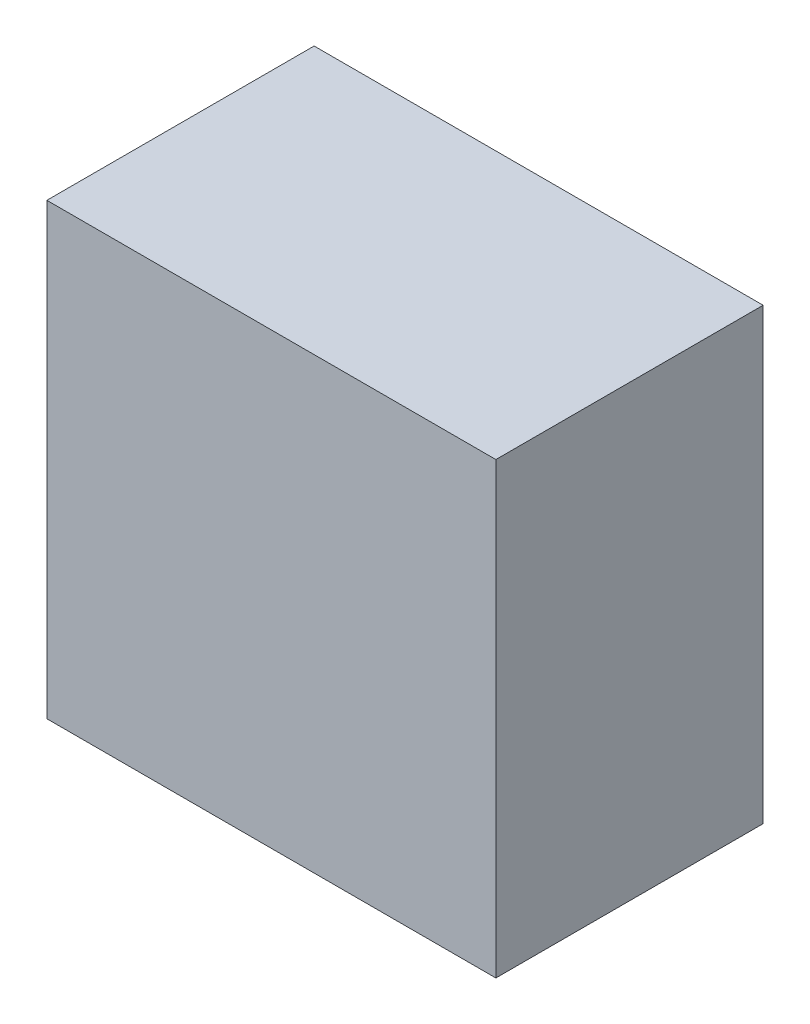
ISO-10303-21;
HEADER;
FILE_DESCRIPTION(('STEP AP214'),'2;1');
FILE_NAME('part.step','',(''),(''),'','','');
FILE_SCHEMA(('AUTOMOTIVE_DESIGN { 1 0 10303 214 1 1 1 1 }'));
ENDSEC;
DATA;
#1=APPLICATION_CONTEXT('core data for automotive mechanical design processes');
#2=APPLICATION_PROTOCOL_DEFINITION('international standard','automotive_design',2000,#1);
#3=PRODUCT_CONTEXT('',#1,'mechanical');
#4=PRODUCT('Part','Part','',(#3));
#5=PRODUCT_RELATED_PRODUCT_CATEGORY('part','',(#4));
#6=PRODUCT_DEFINITION_FORMATION('','',#4);
#7=PRODUCT_DEFINITION_CONTEXT('part definition',#1,'design');
#8=PRODUCT_DEFINITION('design','',#6,#7);
#9=PRODUCT_DEFINITION_SHAPE('','',#8);
#10=(LENGTH_UNIT() NAMED_UNIT(*) SI_UNIT(.MILLI.,.METRE.));
#11=(NAMED_UNIT(*) PLANE_ANGLE_UNIT() SI_UNIT($,.RADIAN.));
#12=(NAMED_UNIT(*) SI_UNIT($,.STERADIAN.) SOLID_ANGLE_UNIT());
#13=UNCERTAINTY_MEASURE_WITH_UNIT(LENGTH_MEASURE(1.E-05),#10,'distance_accuracy_value','');
#14=(GEOMETRIC_REPRESENTATION_CONTEXT(3) GLOBAL_UNCERTAINTY_ASSIGNED_CONTEXT((#13)) GLOBAL_UNIT_ASSIGNED_CONTEXT((#10,
#11,#12)) REPRESENTATION_CONTEXT('',''));
#15=CARTESIAN_POINT('',(0.,0.,0.));
#16=DIRECTION('',(0.,0.,1.));
#17=DIRECTION('',(1.,0.,0.));
#18=AXIS2_PLACEMENT_3D('',#15,#16,#17);
#19=CARTESIAN_POINT('',(21.,-21.,25.));
#20=DIRECTION('',(-1.,0.,0.));
#21=DIRECTION('',(0.,0.,1.));
#22=AXIS2_PLACEMENT_3D('',#19,#20,#21);
#23=PLANE('',#22);
#24=DIRECTION('',(0.,1.,0.));
#25=VECTOR('',#24,1.);
#26=CARTESIAN_POINT('',(21.,-21.,0.));
#27=LINE('',#26,#25);
#28=CARTESIAN_POINT('',(21.,-21.,0.));
#29=VERTEX_POINT('',#28);
#30=CARTESIAN_POINT('',(21.,21.,0.));
#31=VERTEX_POINT('',#30);
#32=EDGE_CURVE('E96',#29,#31,#27,.T.);
#33=ORIENTED_EDGE('',*,*,#32,.T.);
#34=DIRECTION('',(0.,0.,-1.));
#35=VECTOR('',#34,1.);
#36=CARTESIAN_POINT('',(21.,21.,25.));
#37=LINE('',#36,#35);
#38=CARTESIAN_POINT('',(21.,21.,25.));
#39=VERTEX_POINT('',#38);
#40=EDGE_CURVE('E11',#39,#31,#37,.T.);
#41=ORIENTED_EDGE('',*,*,#40,.F.);
#42=DIRECTION('',(0.,1.,0.));
#43=VECTOR('',#42,1.);
#44=CARTESIAN_POINT('',(21.,-21.,25.));
#45=LINE('',#44,#43);
#46=CARTESIAN_POINT('',(21.,-21.,25.));
#47=VERTEX_POINT('',#46);
#48=EDGE_CURVE('E84',#47,#39,#45,.T.);
#49=ORIENTED_EDGE('',*,*,#48,.F.);
#50=DIRECTION('',(0.,0.,-1.));
#51=VECTOR('',#50,1.);
#52=CARTESIAN_POINT('',(21.,-21.,25.));
#53=LINE('',#52,#51);
#54=EDGE_CURVE('E92',#47,#29,#53,.T.);
#55=ORIENTED_EDGE('',*,*,#54,.T.);
#56=EDGE_LOOP('',(#33,#41,#49,#55));
#57=FACE_BOUND('',#56,.T.);
#58=ADVANCED_FACE('F33',(#57),#23,.F.);
#59=CARTESIAN_POINT('',(-21.,21.,25.));
#60=DIRECTION('',(0.,-1.,0.));
#61=DIRECTION('',(0.,0.,-1.));
#62=AXIS2_PLACEMENT_3D('',#59,#60,#61);
#63=PLANE('',#62);
#64=DIRECTION('',(-1.,0.,0.));
#65=VECTOR('',#64,1.);
#66=CARTESIAN_POINT('',(-21.,21.,0.));
#67=LINE('',#66,#65);
#68=CARTESIAN_POINT('',(-21.,21.,0.));
#69=VERTEX_POINT('',#68);
#70=EDGE_CURVE('E88',#31,#69,#67,.T.);
#71=ORIENTED_EDGE('',*,*,#70,.T.);
#72=DIRECTION('',(0.,0.,-1.));
#73=VECTOR('',#72,1.);
#74=CARTESIAN_POINT('',(-21.,21.,25.));
#75=LINE('',#74,#73);
#76=CARTESIAN_POINT('',(-21.,21.,25.));
#77=VERTEX_POINT('',#76);
#78=EDGE_CURVE('E41',#77,#69,#75,.T.);
#79=ORIENTED_EDGE('',*,*,#78,.F.);
#80=DIRECTION('',(-1.,0.,0.));
#81=VECTOR('',#80,1.);
#82=CARTESIAN_POINT('',(-21.,21.,25.));
#83=LINE('',#82,#81);
#84=EDGE_CURVE('E79',#39,#77,#83,.T.);
#85=ORIENTED_EDGE('',*,*,#84,.F.);
#86=ORIENTED_EDGE('',*,*,#40,.T.);
#87=EDGE_LOOP('',(#71,#79,#85,#86));
#88=FACE_BOUND('',#87,.T.);
#89=ADVANCED_FACE('F87',(#88),#63,.F.);
#90=CARTESIAN_POINT('',(-21.,-21.,25.));
#91=DIRECTION('',(1.,0.,0.));
#92=DIRECTION('',(0.,0.,-1.));
#93=AXIS2_PLACEMENT_3D('',#90,#91,#92);
#94=PLANE('',#93);
#95=DIRECTION('',(0.,-1.,0.));
#96=VECTOR('',#95,1.);
#97=CARTESIAN_POINT('',(-21.,-21.,0.));
#98=LINE('',#97,#96);
#99=CARTESIAN_POINT('',(-21.,-21.,0.));
#100=VERTEX_POINT('',#99);
#101=EDGE_CURVE('E66',#69,#100,#98,.T.);
#102=ORIENTED_EDGE('',*,*,#101,.T.);
#103=DIRECTION('',(0.,0.,-1.));
#104=VECTOR('',#103,1.);
#105=CARTESIAN_POINT('',(-21.,-21.,25.));
#106=LINE('',#105,#104);
#107=CARTESIAN_POINT('',(-21.,-21.,25.));
#108=VERTEX_POINT('',#107);
#109=EDGE_CURVE('E89',#108,#100,#106,.T.);
#110=ORIENTED_EDGE('',*,*,#109,.F.);
#111=DIRECTION('',(0.,-1.,0.));
#112=VECTOR('',#111,1.);
#113=CARTESIAN_POINT('',(-21.,-21.,25.));
#114=LINE('',#113,#112);
#115=EDGE_CURVE('E82',#77,#108,#114,.T.);
#116=ORIENTED_EDGE('',*,*,#115,.F.);
#117=ORIENTED_EDGE('',*,*,#78,.T.);
#118=EDGE_LOOP('',(#102,#110,#116,#117));
#119=FACE_BOUND('',#118,.T.);
#120=ADVANCED_FACE('F90',(#119),#94,.F.);
#121=CARTESIAN_POINT('',(-21.,-21.,25.));
#122=DIRECTION('',(0.,1.,0.));
#123=DIRECTION('',(0.,0.,1.));
#124=AXIS2_PLACEMENT_3D('',#121,#122,#123);
#125=PLANE('',#124);
#126=DIRECTION('',(1.,0.,0.));
#127=VECTOR('',#126,1.);
#128=CARTESIAN_POINT('',(-21.,-21.,0.));
#129=LINE('',#128,#127);
#130=EDGE_CURVE('E72',#100,#29,#129,.T.);
#131=ORIENTED_EDGE('',*,*,#130,.T.);
#132=ORIENTED_EDGE('',*,*,#54,.F.);
#133=DIRECTION('',(1.,0.,0.));
#134=VECTOR('',#133,1.);
#135=CARTESIAN_POINT('',(-21.,-21.,25.));
#136=LINE('',#135,#134);
#137=EDGE_CURVE('E49',#108,#47,#136,.T.);
#138=ORIENTED_EDGE('',*,*,#137,.F.);
#139=ORIENTED_EDGE('',*,*,#109,.T.);
#140=EDGE_LOOP('',(#131,#132,#138,#139));
#141=FACE_BOUND('',#140,.T.);
#142=ADVANCED_FACE('F103',(#141),#125,.F.);
#143=CARTESIAN_POINT('',(0.,0.,25.));
#144=DIRECTION('',(0.,0.,-1.));
#145=DIRECTION('',(-1.,0.,0.));
#146=AXIS2_PLACEMENT_3D('',#143,#144,#145);
#147=PLANE('',#146);
#148=ORIENTED_EDGE('',*,*,#48,.T.);
#149=ORIENTED_EDGE('',*,*,#84,.T.);
#150=ORIENTED_EDGE('',*,*,#115,.T.);
#151=ORIENTED_EDGE('',*,*,#137,.T.);
#152=EDGE_LOOP('',(#148,#149,#150,#151));
#153=FACE_BOUND('',#152,.T.);
#154=ADVANCED_FACE('F80',(#153),#147,.F.);
#155=CARTESIAN_POINT('',(0.,0.,0.));
#156=DIRECTION('',(0.,0.,-1.));
#157=DIRECTION('',(-1.,0.,0.));
#158=AXIS2_PLACEMENT_3D('',#155,#156,#157);
#159=PLANE('',#158);
#160=ORIENTED_EDGE('',*,*,#32,.F.);
#161=ORIENTED_EDGE('',*,*,#130,.F.);
#162=ORIENTED_EDGE('',*,*,#101,.F.);
#163=ORIENTED_EDGE('',*,*,#70,.F.);
#164=EDGE_LOOP('',(#160,#161,#162,#163));
#165=FACE_BOUND('',#164,.T.);
#166=ADVANCED_FACE('F106',(#165),#159,.T.);
#167=CLOSED_SHELL('',(#58,#89,#120,#142,#154,#166));
#168=MANIFOLD_SOLID_BREP('B2',#167);
#169=ADVANCED_BREP_SHAPE_REPRESENTATION('',(#18,#168),#14);
#170=SHAPE_DEFINITION_REPRESENTATION(#9,#169);
ENDSEC;
END-ISO-10303-21;
